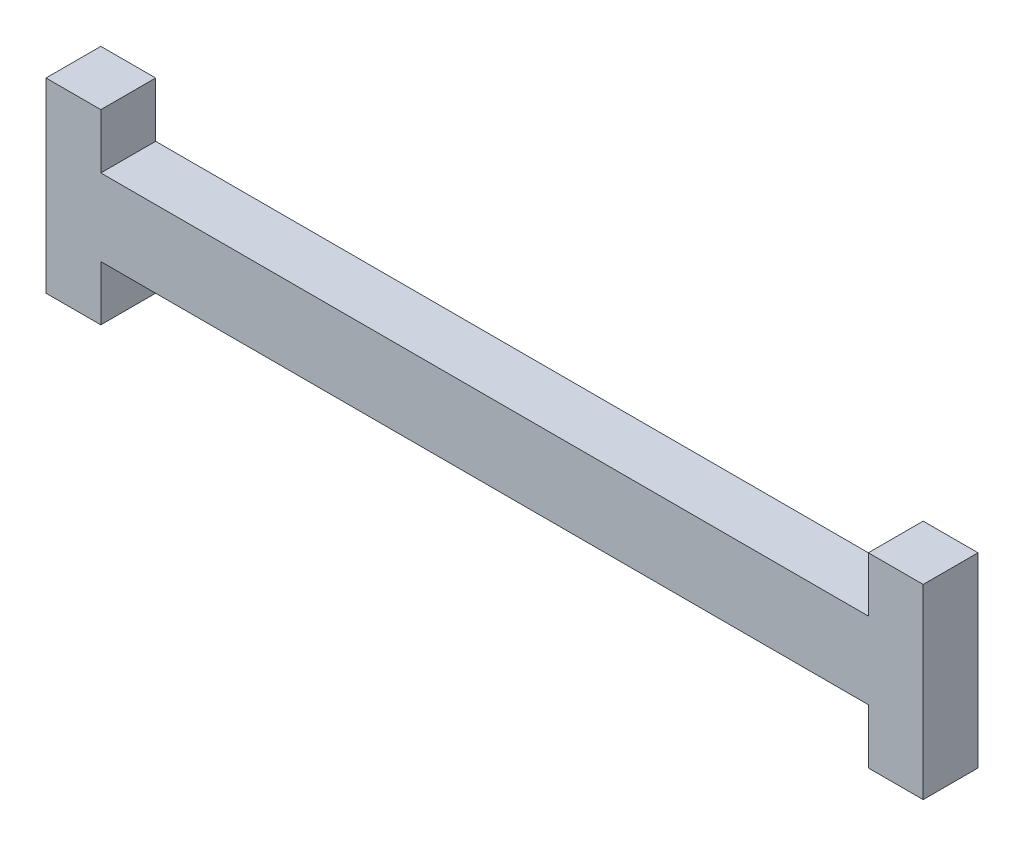
ISO-10303-21;
HEADER;
FILE_DESCRIPTION(('STEP AP214'),'2;1');
FILE_NAME('part.step','',(''),(''),'','','');
FILE_SCHEMA(('AUTOMOTIVE_DESIGN { 1 0 10303 214 1 1 1 1 }'));
ENDSEC;
DATA;
#1=APPLICATION_CONTEXT('core data for automotive mechanical design processes');
#2=APPLICATION_PROTOCOL_DEFINITION('international standard','automotive_design',2000,#1);
#3=PRODUCT_CONTEXT('',#1,'mechanical');
#4=PRODUCT('Part','Part','',(#3));
#5=PRODUCT_RELATED_PRODUCT_CATEGORY('part','',(#4));
#6=PRODUCT_DEFINITION_FORMATION('','',#4);
#7=PRODUCT_DEFINITION_CONTEXT('part definition',#1,'design');
#8=PRODUCT_DEFINITION('design','',#6,#7);
#9=PRODUCT_DEFINITION_SHAPE('','',#8);
#10=(LENGTH_UNIT() NAMED_UNIT(*) SI_UNIT(.MILLI.,.METRE.));
#11=(NAMED_UNIT(*) PLANE_ANGLE_UNIT() SI_UNIT($,.RADIAN.));
#12=(NAMED_UNIT(*) SI_UNIT($,.STERADIAN.) SOLID_ANGLE_UNIT());
#13=UNCERTAINTY_MEASURE_WITH_UNIT(LENGTH_MEASURE(1.E-05),#10,'distance_accuracy_value','');
#14=(GEOMETRIC_REPRESENTATION_CONTEXT(3) GLOBAL_UNCERTAINTY_ASSIGNED_CONTEXT((#13)) GLOBAL_UNIT_ASSIGNED_CONTEXT((#10,
#11,#12)) REPRESENTATION_CONTEXT('',''));
#15=CARTESIAN_POINT('',(0.,0.,0.));
#16=DIRECTION('',(0.,0.,1.));
#17=DIRECTION('',(1.,0.,0.));
#18=AXIS2_PLACEMENT_3D('',#15,#16,#17);
#19=CARTESIAN_POINT('',(121.174614020416,222.421111622309,-5.));
#20=DIRECTION('',(-1.,0.,0.));
#21=DIRECTION('',(0.,-1.,0.));
#22=AXIS2_PLACEMENT_3D('',#19,#20,#21);
#23=PLANE('',#22);
#24=DIRECTION('',(0.,-1.,0.));
#25=VECTOR('',#24,1.);
#26=CARTESIAN_POINT('',(121.174614020416,222.421111622309,0.));
#27=LINE('',#26,#25);
#28=CARTESIAN_POINT('',(121.174614020416,222.421111622309,0.));
#29=VERTEX_POINT('',#28);
#30=CARTESIAN_POINT('',(121.174614020416,205.421111622309,0.));
#31=VERTEX_POINT('',#30);
#32=EDGE_CURVE('E154',#29,#31,#27,.T.);
#33=ORIENTED_EDGE('',*,*,#32,.F.);
#34=DIRECTION('',(0.,0.,1.));
#35=VECTOR('',#34,1.);
#36=CARTESIAN_POINT('',(121.174614020416,222.421111622309,-5.));
#37=LINE('',#36,#35);
#38=CARTESIAN_POINT('',(121.174614020416,222.421111622309,-5.));
#39=VERTEX_POINT('',#38);
#40=EDGE_CURVE('E11',#39,#29,#37,.T.);
#41=ORIENTED_EDGE('',*,*,#40,.F.);
#42=DIRECTION('',(0.,-1.,0.));
#43=VECTOR('',#42,1.);
#44=CARTESIAN_POINT('',(121.174614020416,222.421111622309,-5.));
#45=LINE('',#44,#43);
#46=CARTESIAN_POINT('',(121.174614020416,205.421111622309,-5.));
#47=VERTEX_POINT('',#46);
#48=EDGE_CURVE('E186',#39,#47,#45,.T.);
#49=ORIENTED_EDGE('',*,*,#48,.T.);
#50=DIRECTION('',(0.,0.,1.));
#51=VECTOR('',#50,1.);
#52=CARTESIAN_POINT('',(121.174614020416,205.421111622309,-5.));
#53=LINE('',#52,#51);
#54=EDGE_CURVE('E36',#47,#31,#53,.T.);
#55=ORIENTED_EDGE('',*,*,#54,.T.);
#56=EDGE_LOOP('',(#33,#41,#49,#55));
#57=FACE_BOUND('',#56,.T.);
#58=ADVANCED_FACE('F33',(#57),#23,.T.);
#59=CARTESIAN_POINT('',(121.174614020416,222.421111622309,-5.));
#60=DIRECTION('',(0.,1.,0.));
#61=DIRECTION('',(0.,0.,1.));
#62=AXIS2_PLACEMENT_3D('',#59,#60,#61);
#63=PLANE('',#62);
#64=DIRECTION('',(-1.,0.,0.));
#65=VECTOR('',#64,1.);
#66=CARTESIAN_POINT('',(121.174614020416,222.421111622309,0.));
#67=LINE('',#66,#65);
#68=CARTESIAN_POINT('',(126.174614020416,222.421111622309,0.));
#69=VERTEX_POINT('',#68);
#70=EDGE_CURVE('E184',#69,#29,#67,.T.);
#71=ORIENTED_EDGE('',*,*,#70,.F.);
#72=DIRECTION('',(0.,0.,1.));
#73=VECTOR('',#72,1.);
#74=CARTESIAN_POINT('',(126.174614020416,222.421111622309,-5.));
#75=LINE('',#74,#73);
#76=CARTESIAN_POINT('',(126.174614020416,222.421111622309,-5.));
#77=VERTEX_POINT('',#76);
#78=EDGE_CURVE('E42',#77,#69,#75,.T.);
#79=ORIENTED_EDGE('',*,*,#78,.F.);
#80=DIRECTION('',(-1.,0.,0.));
#81=VECTOR('',#80,1.);
#82=CARTESIAN_POINT('',(121.174614020416,222.421111622309,-5.));
#83=LINE('',#82,#81);
#84=EDGE_CURVE('E144',#77,#39,#83,.T.);
#85=ORIENTED_EDGE('',*,*,#84,.T.);
#86=ORIENTED_EDGE('',*,*,#40,.T.);
#87=EDGE_LOOP('',(#71,#79,#85,#86));
#88=FACE_BOUND('',#87,.T.);
#89=ADVANCED_FACE('F206',(#88),#63,.T.);
#90=CARTESIAN_POINT('',(126.174614020416,222.421111622309,-5.));
#91=DIRECTION('',(1.,0.,0.));
#92=DIRECTION('',(0.,0.,-1.));
#93=AXIS2_PLACEMENT_3D('',#90,#91,#92);
#94=PLANE('',#93);
#95=DIRECTION('',(0.,1.,0.));
#96=VECTOR('',#95,1.);
#97=CARTESIAN_POINT('',(126.174614020416,222.421111622309,0.));
#98=LINE('',#97,#96);
#99=CARTESIAN_POINT('',(126.174614020416,217.421111622309,0.));
#100=VERTEX_POINT('',#99);
#101=EDGE_CURVE('E131',#100,#69,#98,.T.);
#102=ORIENTED_EDGE('',*,*,#101,.F.);
#103=DIRECTION('',(0.,0.,1.));
#104=VECTOR('',#103,1.);
#105=CARTESIAN_POINT('',(126.174614020416,217.421111622309,-5.));
#106=LINE('',#105,#104);
#107=CARTESIAN_POINT('',(126.174614020416,217.421111622309,-5.));
#108=VERTEX_POINT('',#107);
#109=EDGE_CURVE('E126',#108,#100,#106,.T.);
#110=ORIENTED_EDGE('',*,*,#109,.F.);
#111=DIRECTION('',(0.,1.,0.));
#112=VECTOR('',#111,1.);
#113=CARTESIAN_POINT('',(126.174614020416,222.421111622309,-5.));
#114=LINE('',#113,#112);
#115=EDGE_CURVE('E129',#108,#77,#114,.T.);
#116=ORIENTED_EDGE('',*,*,#115,.T.);
#117=ORIENTED_EDGE('',*,*,#78,.T.);
#118=EDGE_LOOP('',(#102,#110,#116,#117));
#119=FACE_BOUND('',#118,.T.);
#120=ADVANCED_FACE('F128',(#119),#94,.T.);
#121=CARTESIAN_POINT('',(126.174614020416,217.421111622309,-5.));
#122=DIRECTION('',(0.,1.,0.));
#123=DIRECTION('',(0.,0.,1.));
#124=AXIS2_PLACEMENT_3D('',#121,#122,#123);
#125=PLANE('',#124);
#126=DIRECTION('',(-1.,0.,0.));
#127=VECTOR('',#126,1.);
#128=CARTESIAN_POINT('',(126.174614020416,217.421111622309,0.));
#129=LINE('',#128,#127);
#130=CARTESIAN_POINT('',(196.174614020416,217.421111622309,0.));
#131=VERTEX_POINT('',#130);
#132=EDGE_CURVE('E181',#131,#100,#129,.T.);
#133=ORIENTED_EDGE('',*,*,#132,.F.);
#134=DIRECTION('',(0.,0.,1.));
#135=VECTOR('',#134,1.);
#136=CARTESIAN_POINT('',(196.174614020416,217.421111622309,-5.));
#137=LINE('',#136,#135);
#138=CARTESIAN_POINT('',(196.174614020416,217.421111622309,-5.));
#139=VERTEX_POINT('',#138);
#140=EDGE_CURVE('E136',#139,#131,#137,.T.);
#141=ORIENTED_EDGE('',*,*,#140,.F.);
#142=DIRECTION('',(-1.,0.,0.));
#143=VECTOR('',#142,1.);
#144=CARTESIAN_POINT('',(126.174614020416,217.421111622309,-5.));
#145=LINE('',#144,#143);
#146=EDGE_CURVE('E142',#139,#108,#145,.T.);
#147=ORIENTED_EDGE('',*,*,#146,.T.);
#148=ORIENTED_EDGE('',*,*,#109,.T.);
#149=EDGE_LOOP('',(#133,#141,#147,#148));
#150=FACE_BOUND('',#149,.T.);
#151=ADVANCED_FACE('F146',(#150),#125,.T.);
#152=CARTESIAN_POINT('',(196.174614020416,222.421111622309,-5.));
#153=DIRECTION('',(-1.,0.,0.));
#154=DIRECTION('',(0.,0.,1.));
#155=AXIS2_PLACEMENT_3D('',#152,#153,#154);
#156=PLANE('',#155);
#157=DIRECTION('',(0.,-1.,0.));
#158=VECTOR('',#157,1.);
#159=CARTESIAN_POINT('',(196.174614020416,222.421111622309,0.));
#160=LINE('',#159,#158);
#161=CARTESIAN_POINT('',(196.174614020416,222.421111622309,0.));
#162=VERTEX_POINT('',#161);
#163=EDGE_CURVE('E178',#162,#131,#160,.T.);
#164=ORIENTED_EDGE('',*,*,#163,.F.);
#165=DIRECTION('',(0.,0.,1.));
#166=VECTOR('',#165,1.);
#167=CARTESIAN_POINT('',(196.174614020416,222.421111622309,-5.));
#168=LINE('',#167,#166);
#169=CARTESIAN_POINT('',(196.174614020416,222.421111622309,-5.));
#170=VERTEX_POINT('',#169);
#171=EDGE_CURVE('E190',#170,#162,#168,.T.);
#172=ORIENTED_EDGE('',*,*,#171,.F.);
#173=DIRECTION('',(0.,-1.,0.));
#174=VECTOR('',#173,1.);
#175=CARTESIAN_POINT('',(196.174614020416,222.421111622309,-5.));
#176=LINE('',#175,#174);
#177=EDGE_CURVE('E147',#170,#139,#176,.T.);
#178=ORIENTED_EDGE('',*,*,#177,.T.);
#179=ORIENTED_EDGE('',*,*,#140,.T.);
#180=EDGE_LOOP('',(#164,#172,#178,#179));
#181=FACE_BOUND('',#180,.T.);
#182=ADVANCED_FACE('F219',(#181),#156,.T.);
#183=CARTESIAN_POINT('',(201.174614020416,222.421111622309,-5.));
#184=DIRECTION('',(0.,1.,0.));
#185=DIRECTION('',(-1.,0.,0.));
#186=AXIS2_PLACEMENT_3D('',#183,#184,#185);
#187=PLANE('',#186);
#188=DIRECTION('',(-1.,0.,0.));
#189=VECTOR('',#188,1.);
#190=CARTESIAN_POINT('',(201.174614020416,222.421111622309,0.));
#191=LINE('',#190,#189);
#192=CARTESIAN_POINT('',(201.174614020416,222.421111622309,0.));
#193=VERTEX_POINT('',#192);
#194=EDGE_CURVE('E175',#193,#162,#191,.T.);
#195=ORIENTED_EDGE('',*,*,#194,.F.);
#196=DIRECTION('',(0.,0.,1.));
#197=VECTOR('',#196,1.);
#198=CARTESIAN_POINT('',(201.174614020416,222.421111622309,-5.));
#199=LINE('',#198,#197);
#200=CARTESIAN_POINT('',(201.174614020416,222.421111622309,-5.));
#201=VERTEX_POINT('',#200);
#202=EDGE_CURVE('E192',#201,#193,#199,.T.);
#203=ORIENTED_EDGE('',*,*,#202,.F.);
#204=DIRECTION('',(-1.,0.,0.));
#205=VECTOR('',#204,1.);
#206=CARTESIAN_POINT('',(201.174614020416,222.421111622309,-5.));
#207=LINE('',#206,#205);
#208=EDGE_CURVE('E149',#201,#170,#207,.T.);
#209=ORIENTED_EDGE('',*,*,#208,.T.);
#210=ORIENTED_EDGE('',*,*,#171,.T.);
#211=EDGE_LOOP('',(#195,#203,#209,#210));
#212=FACE_BOUND('',#211,.T.);
#213=ADVANCED_FACE('F222',(#212),#187,.T.);
#214=CARTESIAN_POINT('',(201.174614020416,222.421111622309,-5.));
#215=DIRECTION('',(1.,0.,0.));
#216=DIRECTION('',(0.,1.,0.));
#217=AXIS2_PLACEMENT_3D('',#214,#215,#216);
#218=PLANE('',#217);
#219=DIRECTION('',(0.,1.,0.));
#220=VECTOR('',#219,1.);
#221=CARTESIAN_POINT('',(201.174614020416,222.421111622309,0.));
#222=LINE('',#221,#220);
#223=CARTESIAN_POINT('',(201.174614020416,205.421111622309,0.));
#224=VERTEX_POINT('',#223);
#225=EDGE_CURVE('E172',#224,#193,#222,.T.);
#226=ORIENTED_EDGE('',*,*,#225,.F.);
#227=DIRECTION('',(0.,0.,1.));
#228=VECTOR('',#227,1.);
#229=CARTESIAN_POINT('',(201.174614020416,205.421111622309,-5.));
#230=LINE('',#229,#228);
#231=CARTESIAN_POINT('',(201.174614020416,205.421111622309,-5.));
#232=VERTEX_POINT('',#231);
#233=EDGE_CURVE('E194',#232,#224,#230,.T.);
#234=ORIENTED_EDGE('',*,*,#233,.F.);
#235=DIRECTION('',(0.,1.,0.));
#236=VECTOR('',#235,1.);
#237=CARTESIAN_POINT('',(201.174614020416,222.421111622309,-5.));
#238=LINE('',#237,#236);
#239=EDGE_CURVE('E348',#232,#201,#238,.T.);
#240=ORIENTED_EDGE('',*,*,#239,.T.);
#241=ORIENTED_EDGE('',*,*,#202,.T.);
#242=EDGE_LOOP('',(#226,#234,#240,#241));
#243=FACE_BOUND('',#242,.T.);
#244=ADVANCED_FACE('F226',(#243),#218,.T.);
#245=CARTESIAN_POINT('',(201.174614020416,205.421111622309,-5.));
#246=DIRECTION('',(0.,-1.,0.));
#247=DIRECTION('',(1.,0.,0.));
#248=AXIS2_PLACEMENT_3D('',#245,#246,#247);
#249=PLANE('',#248);
#250=DIRECTION('',(1.,0.,0.));
#251=VECTOR('',#250,1.);
#252=CARTESIAN_POINT('',(201.174614020416,205.421111622309,0.));
#253=LINE('',#252,#251);
#254=CARTESIAN_POINT('',(196.174614020416,205.421111622309,0.));
#255=VERTEX_POINT('',#254);
#256=EDGE_CURVE('E169',#255,#224,#253,.T.);
#257=ORIENTED_EDGE('',*,*,#256,.F.);
#258=DIRECTION('',(0.,0.,1.));
#259=VECTOR('',#258,1.);
#260=CARTESIAN_POINT('',(196.174614020416,205.421111622309,-5.));
#261=LINE('',#260,#259);
#262=CARTESIAN_POINT('',(196.174614020416,205.421111622309,-5.));
#263=VERTEX_POINT('',#262);
#264=EDGE_CURVE('E196',#263,#255,#261,.T.);
#265=ORIENTED_EDGE('',*,*,#264,.F.);
#266=DIRECTION('',(1.,0.,0.));
#267=VECTOR('',#266,1.);
#268=CARTESIAN_POINT('',(201.174614020416,205.421111622309,-5.));
#269=LINE('',#268,#267);
#270=EDGE_CURVE('E352',#263,#232,#269,.T.);
#271=ORIENTED_EDGE('',*,*,#270,.T.);
#272=ORIENTED_EDGE('',*,*,#233,.T.);
#273=EDGE_LOOP('',(#257,#265,#271,#272));
#274=FACE_BOUND('',#273,.T.);
#275=ADVANCED_FACE('F230',(#274),#249,.T.);
#276=CARTESIAN_POINT('',(196.174614020416,205.421111622309,-5.));
#277=DIRECTION('',(-1.,0.,0.));
#278=DIRECTION('',(0.,-1.,0.));
#279=AXIS2_PLACEMENT_3D('',#276,#277,#278);
#280=PLANE('',#279);
#281=DIRECTION('',(0.,-1.,0.));
#282=VECTOR('',#281,1.);
#283=CARTESIAN_POINT('',(196.174614020416,205.421111622309,0.));
#284=LINE('',#283,#282);
#285=CARTESIAN_POINT('',(196.174614020416,210.421111622309,0.));
#286=VERTEX_POINT('',#285);
#287=EDGE_CURVE('E166',#286,#255,#284,.T.);
#288=ORIENTED_EDGE('',*,*,#287,.F.);
#289=DIRECTION('',(0.,0.,1.));
#290=VECTOR('',#289,1.);
#291=CARTESIAN_POINT('',(196.174614020416,210.421111622309,-5.));
#292=LINE('',#291,#290);
#293=CARTESIAN_POINT('',(196.174614020416,210.421111622309,-5.));
#294=VERTEX_POINT('',#293);
#295=EDGE_CURVE('E198',#294,#286,#292,.T.);
#296=ORIENTED_EDGE('',*,*,#295,.F.);
#297=DIRECTION('',(0.,-1.,0.));
#298=VECTOR('',#297,1.);
#299=CARTESIAN_POINT('',(196.174614020416,205.421111622309,-5.));
#300=LINE('',#299,#298);
#301=EDGE_CURVE('E341',#294,#263,#300,.T.);
#302=ORIENTED_EDGE('',*,*,#301,.T.);
#303=ORIENTED_EDGE('',*,*,#264,.T.);
#304=EDGE_LOOP('',(#288,#296,#302,#303));
#305=FACE_BOUND('',#304,.T.);
#306=ADVANCED_FACE('F234',(#305),#280,.T.);
#307=CARTESIAN_POINT('',(126.174614020416,210.421111622309,-5.));
#308=DIRECTION('',(0.,-1.,0.));
#309=DIRECTION('',(0.,0.,-1.));
#310=AXIS2_PLACEMENT_3D('',#307,#308,#309);
#311=PLANE('',#310);
#312=DIRECTION('',(1.,0.,0.));
#313=VECTOR('',#312,1.);
#314=CARTESIAN_POINT('',(126.174614020416,210.421111622309,0.));
#315=LINE('',#314,#313);
#316=CARTESIAN_POINT('',(126.174614020416,210.421111622309,0.));
#317=VERTEX_POINT('',#316);
#318=EDGE_CURVE('E163',#317,#286,#315,.T.);
#319=ORIENTED_EDGE('',*,*,#318,.F.);
#320=DIRECTION('',(0.,0.,1.));
#321=VECTOR('',#320,1.);
#322=CARTESIAN_POINT('',(126.174614020416,210.421111622309,-5.));
#323=LINE('',#322,#321);
#324=CARTESIAN_POINT('',(126.174614020416,210.421111622309,-5.));
#325=VERTEX_POINT('',#324);
#326=EDGE_CURVE('E200',#325,#317,#323,.T.);
#327=ORIENTED_EDGE('',*,*,#326,.F.);
#328=DIRECTION('',(1.,0.,0.));
#329=VECTOR('',#328,1.);
#330=CARTESIAN_POINT('',(126.174614020416,210.421111622309,-5.));
#331=LINE('',#330,#329);
#332=EDGE_CURVE('E337',#325,#294,#331,.T.);
#333=ORIENTED_EDGE('',*,*,#332,.T.);
#334=ORIENTED_EDGE('',*,*,#295,.T.);
#335=EDGE_LOOP('',(#319,#327,#333,#334));
#336=FACE_BOUND('',#335,.T.);
#337=ADVANCED_FACE('F238',(#336),#311,.T.);
#338=CARTESIAN_POINT('',(126.174614020416,205.421111622309,-5.));
#339=DIRECTION('',(1.,0.,0.));
#340=DIRECTION('',(0.,0.,-1.));
#341=AXIS2_PLACEMENT_3D('',#338,#339,#340);
#342=PLANE('',#341);
#343=DIRECTION('',(0.,1.,0.));
#344=VECTOR('',#343,1.);
#345=CARTESIAN_POINT('',(126.174614020416,205.421111622309,0.));
#346=LINE('',#345,#344);
#347=CARTESIAN_POINT('',(126.174614020416,205.421111622309,0.));
#348=VERTEX_POINT('',#347);
#349=EDGE_CURVE('E160',#348,#317,#346,.T.);
#350=ORIENTED_EDGE('',*,*,#349,.F.);
#351=DIRECTION('',(0.,0.,1.));
#352=VECTOR('',#351,1.);
#353=CARTESIAN_POINT('',(126.174614020416,205.421111622309,-5.));
#354=LINE('',#353,#352);
#355=CARTESIAN_POINT('',(126.174614020416,205.421111622309,-5.));
#356=VERTEX_POINT('',#355);
#357=EDGE_CURVE('E201',#356,#348,#354,.T.);
#358=ORIENTED_EDGE('',*,*,#357,.F.);
#359=DIRECTION('',(0.,1.,0.));
#360=VECTOR('',#359,1.);
#361=CARTESIAN_POINT('',(126.174614020416,205.421111622309,-5.));
#362=LINE('',#361,#360);
#363=EDGE_CURVE('E358',#356,#325,#362,.T.);
#364=ORIENTED_EDGE('',*,*,#363,.T.);
#365=ORIENTED_EDGE('',*,*,#326,.T.);
#366=EDGE_LOOP('',(#350,#358,#364,#365));
#367=FACE_BOUND('',#366,.T.);
#368=ADVANCED_FACE('F242',(#367),#342,.T.);
#369=CARTESIAN_POINT('',(121.174614020416,205.421111622309,-5.));
#370=DIRECTION('',(0.,-1.,0.));
#371=DIRECTION('',(0.,0.,-1.));
#372=AXIS2_PLACEMENT_3D('',#369,#370,#371);
#373=PLANE('',#372);
#374=DIRECTION('',(1.,0.,0.));
#375=VECTOR('',#374,1.);
#376=CARTESIAN_POINT('',(121.174614020416,205.421111622309,0.));
#377=LINE('',#376,#375);
#378=EDGE_CURVE('E157',#31,#348,#377,.T.);
#379=ORIENTED_EDGE('',*,*,#378,.F.);
#380=ORIENTED_EDGE('',*,*,#54,.F.);
#381=DIRECTION('',(1.,0.,0.));
#382=VECTOR('',#381,1.);
#383=CARTESIAN_POINT('',(121.174614020416,205.421111622309,-5.));
#384=LINE('',#383,#382);
#385=EDGE_CURVE('E360',#47,#356,#384,.T.);
#386=ORIENTED_EDGE('',*,*,#385,.T.);
#387=ORIENTED_EDGE('',*,*,#357,.T.);
#388=EDGE_LOOP('',(#379,#380,#386,#387));
#389=FACE_BOUND('',#388,.T.);
#390=ADVANCED_FACE('F203',(#389),#373,.T.);
#391=CARTESIAN_POINT('',(0.,0.,-5.));
#392=DIRECTION('',(0.,0.,1.));
#393=DIRECTION('',(1.,0.,0.));
#394=AXIS2_PLACEMENT_3D('',#391,#392,#393);
#395=PLANE('',#394);
#396=ORIENTED_EDGE('',*,*,#48,.F.);
#397=ORIENTED_EDGE('',*,*,#84,.F.);
#398=ORIENTED_EDGE('',*,*,#115,.F.);
#399=ORIENTED_EDGE('',*,*,#146,.F.);
#400=ORIENTED_EDGE('',*,*,#177,.F.);
#401=ORIENTED_EDGE('',*,*,#208,.F.);
#402=ORIENTED_EDGE('',*,*,#239,.F.);
#403=ORIENTED_EDGE('',*,*,#270,.F.);
#404=ORIENTED_EDGE('',*,*,#301,.F.);
#405=ORIENTED_EDGE('',*,*,#332,.F.);
#406=ORIENTED_EDGE('',*,*,#363,.F.);
#407=ORIENTED_EDGE('',*,*,#385,.F.);
#408=EDGE_LOOP('',(#396,#397,#398,#399,#400,#401,#402,#403,#404,#405,#406,#407));
#409=FACE_BOUND('',#408,.T.);
#410=ADVANCED_FACE('F140',(#409),#395,.F.);
#411=CARTESIAN_POINT('',(0.,0.,0.));
#412=DIRECTION('',(0.,0.,1.));
#413=DIRECTION('',(1.,0.,0.));
#414=AXIS2_PLACEMENT_3D('',#411,#412,#413);
#415=PLANE('',#414);
#416=ORIENTED_EDGE('',*,*,#32,.T.);
#417=ORIENTED_EDGE('',*,*,#378,.T.);
#418=ORIENTED_EDGE('',*,*,#349,.T.);
#419=ORIENTED_EDGE('',*,*,#318,.T.);
#420=ORIENTED_EDGE('',*,*,#287,.T.);
#421=ORIENTED_EDGE('',*,*,#256,.T.);
#422=ORIENTED_EDGE('',*,*,#225,.T.);
#423=ORIENTED_EDGE('',*,*,#194,.T.);
#424=ORIENTED_EDGE('',*,*,#163,.T.);
#425=ORIENTED_EDGE('',*,*,#132,.T.);
#426=ORIENTED_EDGE('',*,*,#101,.T.);
#427=ORIENTED_EDGE('',*,*,#70,.T.);
#428=EDGE_LOOP('',(#416,#417,#418,#419,#420,#421,#422,#423,#424,#425,#426,#427));
#429=FACE_BOUND('',#428,.T.);
#430=ADVANCED_FACE('F205',(#429),#415,.T.);
#431=CLOSED_SHELL('',(#58,#89,#120,#151,#182,#213,#244,#275,#306,#337,#368,#390,#410,#430));
#432=MANIFOLD_SOLID_BREP('B2',#431);
#433=ADVANCED_BREP_SHAPE_REPRESENTATION('',(#18,#432),#14);
#434=SHAPE_DEFINITION_REPRESENTATION(#9,#433);
ENDSEC;
END-ISO-10303-21;
